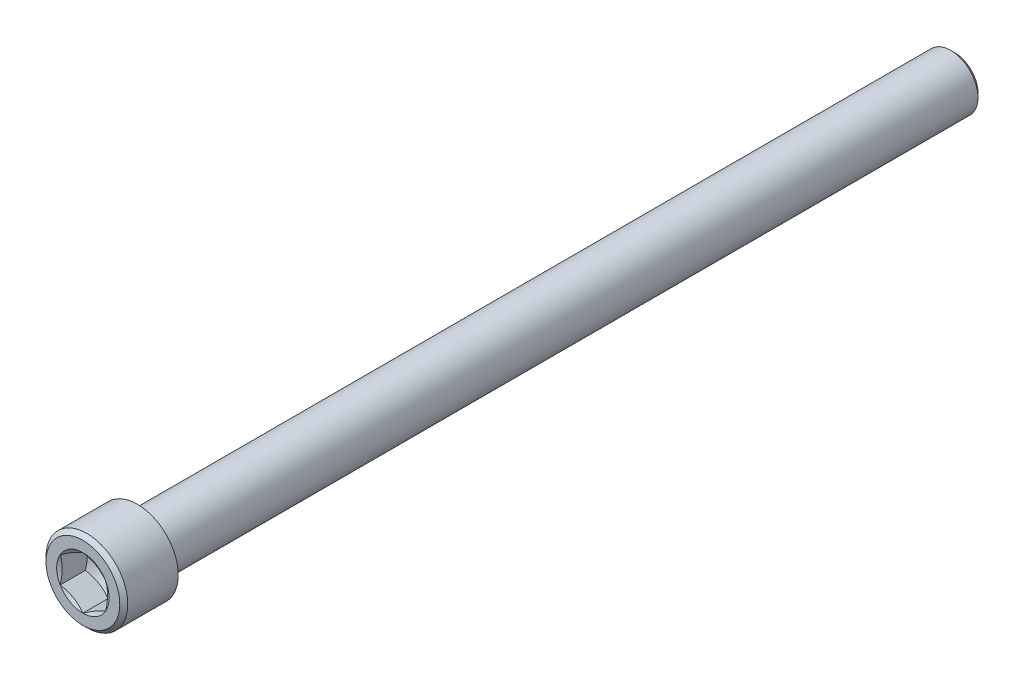
ISO-10303-21;
HEADER;
FILE_DESCRIPTION(('STEP AP214'),'2;1');
FILE_NAME('part.step','',(''),(''),'','','');
FILE_SCHEMA(('AUTOMOTIVE_DESIGN { 1 0 10303 214 1 1 1 1 }'));
ENDSEC;
DATA;
#1=APPLICATION_CONTEXT('core data for automotive mechanical design processes');
#2=APPLICATION_PROTOCOL_DEFINITION('international standard','automotive_design',2000,#1);
#3=PRODUCT_CONTEXT('',#1,'mechanical');
#4=PRODUCT('Part','Part','',(#3));
#5=PRODUCT_RELATED_PRODUCT_CATEGORY('part','',(#4));
#6=PRODUCT_DEFINITION_FORMATION('','',#4);
#7=PRODUCT_DEFINITION_CONTEXT('part definition',#1,'design');
#8=PRODUCT_DEFINITION('design','',#6,#7);
#9=PRODUCT_DEFINITION_SHAPE('','',#8);
#10=(LENGTH_UNIT() NAMED_UNIT(*) SI_UNIT(.MILLI.,.METRE.));
#11=(NAMED_UNIT(*) PLANE_ANGLE_UNIT() SI_UNIT($,.RADIAN.));
#12=(NAMED_UNIT(*) SI_UNIT($,.STERADIAN.) SOLID_ANGLE_UNIT());
#13=UNCERTAINTY_MEASURE_WITH_UNIT(LENGTH_MEASURE(1.E-05),#10,'distance_accuracy_value','');
#14=(GEOMETRIC_REPRESENTATION_CONTEXT(3) GLOBAL_UNCERTAINTY_ASSIGNED_CONTEXT((#13)) GLOBAL_UNIT_ASSIGNED_CONTEXT((#10,
#11,#12)) REPRESENTATION_CONTEXT('',''));
#15=CARTESIAN_POINT('',(0.,0.,0.));
#16=DIRECTION('',(0.,0.,1.));
#17=DIRECTION('',(1.,0.,0.));
#18=AXIS2_PLACEMENT_3D('',#15,#16,#17);
#19=CARTESIAN_POINT('',(0.,9.,12.));
#20=DIRECTION('',(0.,0.,-1.));
#21=DIRECTION('',(0.,1.,0.));
#22=AXIS2_PLACEMENT_3D('',#19,#20,#21);
#23=PLANE('',#22);
#24=CARTESIAN_POINT('',(0.,0.,12.));
#25=DIRECTION('',(0.,0.,-1.));
#26=DIRECTION('',(0.,1.,0.));
#27=AXIS2_PLACEMENT_3D('',#24,#25,#26);
#28=CIRCLE('',#27,8.125);
#29=CARTESIAN_POINT('',(0.,8.125,12.));
#30=VERTEX_POINT('',#29);
#31=EDGE_CURVE('E287',#30,#30,#28,.F.);
#32=ORIENTED_EDGE('',*,*,#31,.T.);
#33=EDGE_LOOP('',(#32));
#34=FACE_BOUND('',#33,.T.);
#35=CARTESIAN_POINT('',(0.,0.,12.));
#36=DIRECTION('',(0.,0.,-1.));
#37=DIRECTION('',(0.,1.,0.));
#38=AXIS2_PLACEMENT_3D('',#35,#36,#37);
#39=CIRCLE('',#38,5.77350269189626);
#40=CARTESIAN_POINT('',(0.,5.77350269189626,12.));
#41=VERTEX_POINT('',#40);
#42=CARTESIAN_POINT('',(-5.,2.88675134594813,12.));
#43=VERTEX_POINT('',#42);
#44=EDGE_CURVE('E111',#41,#43,#39,.F.);
#45=ORIENTED_EDGE('',*,*,#44,.F.);
#46=CARTESIAN_POINT('',(5.,2.88675134594813,12.));
#47=VERTEX_POINT('',#46);
#48=EDGE_CURVE('E100',#47,#41,#39,.F.);
#49=ORIENTED_EDGE('',*,*,#48,.F.);
#50=CARTESIAN_POINT('',(5.,-2.88675134594813,12.));
#51=VERTEX_POINT('',#50);
#52=EDGE_CURVE('E109',#51,#47,#39,.F.);
#53=ORIENTED_EDGE('',*,*,#52,.F.);
#54=CARTESIAN_POINT('',(0.,-5.77350269189626,12.));
#55=VERTEX_POINT('',#54);
#56=EDGE_CURVE('E424',#55,#51,#39,.F.);
#57=ORIENTED_EDGE('',*,*,#56,.F.);
#58=CARTESIAN_POINT('',(-5.,-2.88675134594813,12.));
#59=VERTEX_POINT('',#58);
#60=EDGE_CURVE('E139',#59,#55,#39,.F.);
#61=ORIENTED_EDGE('',*,*,#60,.F.);
#62=EDGE_CURVE('E138',#43,#59,#39,.F.);
#63=ORIENTED_EDGE('',*,*,#62,.F.);
#64=EDGE_LOOP('',(#45,#49,#53,#57,#61,#63));
#65=FACE_BOUND('',#64,.T.);
#66=ADVANCED_FACE('F44',(#34,#65),#23,.F.);
#67=CARTESIAN_POINT('',(0.,6.,0.));
#68=DIRECTION('',(0.,0.,1.));
#69=DIRECTION('',(0.,-1.,0.));
#70=AXIS2_PLACEMENT_3D('',#67,#68,#69);
#71=PLANE('',#70);
#72=CARTESIAN_POINT('',(0.,0.,0.));
#73=DIRECTION('',(0.,0.,1.));
#74=DIRECTION('',(0.,-1.,0.));
#75=AXIS2_PLACEMENT_3D('',#72,#73,#74);
#76=CIRCLE('',#75,6.6);
#77=CARTESIAN_POINT('',(0.,-6.6,0.));
#78=VERTEX_POINT('',#77);
#79=EDGE_CURVE('E52',#78,#78,#76,.T.);
#80=ORIENTED_EDGE('',*,*,#79,.T.);
#81=EDGE_LOOP('',(#80));
#82=FACE_BOUND('',#81,.T.);
#83=CARTESIAN_POINT('',(0.,0.,0.));
#84=DIRECTION('',(0.,0.,1.));
#85=DIRECTION('',(0.,-1.,0.));
#86=AXIS2_PLACEMENT_3D('',#83,#84,#85);
#87=CIRCLE('',#86,9.);
#88=CARTESIAN_POINT('',(0.,-9.,0.));
#89=VERTEX_POINT('',#88);
#90=EDGE_CURVE('E403',#89,#89,#87,.T.);
#91=ORIENTED_EDGE('',*,*,#90,.F.);
#92=EDGE_LOOP('',(#91));
#93=FACE_BOUND('',#92,.T.);
#94=ADVANCED_FACE('F249',(#82,#93),#71,.F.);
#95=CARTESIAN_POINT('',(0.,0.,12.));
#96=DIRECTION('',(0.,0.,1.));
#97=DIRECTION('',(0.,-1.,0.));
#98=AXIS2_PLACEMENT_3D('',#95,#96,#97);
#99=CYLINDRICAL_SURFACE('',#98,6.);
#100=CARTESIAN_POINT('',(0.,0.,-0.6));
#101=DIRECTION('',(0.,0.,1.));
#102=DIRECTION('',(0.,-1.,0.));
#103=AXIS2_PLACEMENT_3D('',#100,#101,#102);
#104=CIRCLE('',#103,6.);
#105=CARTESIAN_POINT('',(0.,-6.,-0.6));
#106=VERTEX_POINT('',#105);
#107=EDGE_CURVE('E12',#106,#106,#104,.F.);
#108=ORIENTED_EDGE('',*,*,#107,.T.);
#109=EDGE_LOOP('',(#108));
#110=FACE_BOUND('',#109,.T.);
#111=CARTESIAN_POINT('',(0.,0.,-179.125));
#112=DIRECTION('',(0.,0.,1.));
#113=DIRECTION('',(0.,-1.,0.));
#114=AXIS2_PLACEMENT_3D('',#111,#112,#113);
#115=CIRCLE('',#114,6.);
#116=CARTESIAN_POINT('',(0.,-6.,-179.125));
#117=VERTEX_POINT('',#116);
#118=EDGE_CURVE('E281',#117,#117,#115,.T.);
#119=ORIENTED_EDGE('',*,*,#118,.T.);
#120=EDGE_LOOP('',(#119));
#121=FACE_BOUND('',#120,.T.);
#122=ADVANCED_FACE('F255',(#110,#121),#99,.T.);
#123=CARTESIAN_POINT('',(0.,0.,-180.));
#124=DIRECTION('',(0.,0.,1.));
#125=DIRECTION('',(0.,-1.,0.));
#126=AXIS2_PLACEMENT_3D('',#123,#124,#125);
#127=PLANE('',#126);
#128=CARTESIAN_POINT('',(0.,0.,-180.));
#129=DIRECTION('',(0.,0.,1.));
#130=DIRECTION('',(0.,-1.,0.));
#131=AXIS2_PLACEMENT_3D('',#128,#129,#130);
#132=CIRCLE('',#131,5.12499999999998);
#133=CARTESIAN_POINT('',(0.,-5.12499999999998,-180.));
#134=VERTEX_POINT('',#133);
#135=EDGE_CURVE('E121',#134,#134,#132,.F.);
#136=ORIENTED_EDGE('',*,*,#135,.T.);
#137=EDGE_LOOP('',(#136));
#138=FACE_BOUND('',#137,.T.);
#139=ADVANCED_FACE('F260',(#138),#127,.F.);
#140=CARTESIAN_POINT('',(0.,0.,12.));
#141=DIRECTION('',(0.,0.,1.));
#142=DIRECTION('',(0.,-1.,0.));
#143=AXIS2_PLACEMENT_3D('',#140,#141,#142);
#144=CYLINDRICAL_SURFACE('',#143,9.);
#145=CARTESIAN_POINT('',(0.,0.,11.125));
#146=DIRECTION('',(0.,0.,-1.));
#147=DIRECTION('',(0.,1.,0.));
#148=AXIS2_PLACEMENT_3D('',#145,#146,#147);
#149=CIRCLE('',#148,9.);
#150=CARTESIAN_POINT('',(0.,9.,11.125));
#151=VERTEX_POINT('',#150);
#152=EDGE_CURVE('E283',#151,#151,#149,.T.);
#153=ORIENTED_EDGE('',*,*,#152,.T.);
#154=EDGE_LOOP('',(#153));
#155=FACE_BOUND('',#154,.T.);
#156=ORIENTED_EDGE('',*,*,#90,.T.);
#157=EDGE_LOOP('',(#156));
#158=FACE_BOUND('',#157,.T.);
#159=ADVANCED_FACE('F173',(#155,#158),#144,.T.);
#160=CARTESIAN_POINT('',(0.,0.,12.));
#161=DIRECTION('',(0.,0.,-1.));
#162=DIRECTION('',(0.,1.,0.));
#163=AXIS2_PLACEMENT_3D('',#160,#161,#162);
#164=CONICAL_SURFACE('',#163,8.125,0.785398163397442);
#165=ORIENTED_EDGE('',*,*,#152,.F.);
#166=EDGE_LOOP('',(#165));
#167=FACE_BOUND('',#166,.T.);
#168=ORIENTED_EDGE('',*,*,#31,.F.);
#169=EDGE_LOOP('',(#168));
#170=FACE_BOUND('',#169,.T.);
#171=ADVANCED_FACE('F267',(#167,#170),#164,.T.);
#172=CARTESIAN_POINT('',(0.,0.,-179.125));
#173=DIRECTION('',(0.,0.,1.));
#174=DIRECTION('',(0.,-1.,0.));
#175=AXIS2_PLACEMENT_3D('',#172,#173,#174);
#176=CONICAL_SURFACE('',#175,6.,0.785398163397454);
#177=ORIENTED_EDGE('',*,*,#135,.F.);
#178=EDGE_LOOP('',(#177));
#179=FACE_BOUND('',#178,.T.);
#180=ORIENTED_EDGE('',*,*,#118,.F.);
#181=EDGE_LOOP('',(#180));
#182=FACE_BOUND('',#181,.T.);
#183=ADVANCED_FACE('F269',(#179,#182),#176,.T.);
#184=CARTESIAN_POINT('',(0.,0.,11.5534180126148));
#185=DIRECTION('',(0.,0.,1.));
#186=DIRECTION('',(0.,-1.,0.));
#187=AXIS2_PLACEMENT_3D('',#184,#185,#186);
#188=CONICAL_SURFACE('',#187,5.,1.04719755119659);
#189=ORIENTED_EDGE('',*,*,#44,.T.);
#190=CARTESIAN_POINT('',(-5.0002,2.88663587589429,12.0000666686666));
#191=CARTESIAN_POINT('',(-4.78046540547481,3.01349970319368,11.9268045802524));
#192=CARTESIAN_POINT('',(-4.55885141554042,3.14144859993849,11.8601693345329));
#193=CARTESIAN_POINT('',(-4.11178600454648,3.39956193532121,11.7438570036256));
#194=CARTESIAN_POINT('',(-3.88632664040922,3.52973095989718,11.6942210625306));
#195=CARTESIAN_POINT('',(-3.43816769477649,3.78847564779798,11.6169690380335));
#196=CARTESIAN_POINT('',(-3.2155379068958,3.91701101576052,11.5888383908983));
#197=CARTESIAN_POINT('',(-2.88081009815335,4.11026620624323,11.5636129345685));
#198=CARTESIAN_POINT('',(-2.76915780319493,4.17472868879311,11.5580314723843));
#199=CARTESIAN_POINT('',(-2.5457500293262,4.30371322717528,11.5526202293663));
#200=CARTESIAN_POINT('',(-2.43399455370968,4.36823528110589,11.552790270873));
#201=CARTESIAN_POINT('',(-2.12781576914936,4.54500768479195,11.5611716444068));
#202=CARTESIAN_POINT('',(-1.93349391403278,4.65719946015293,11.575247784512));
#203=CARTESIAN_POINT('',(-1.54613989800229,4.88083840557981,11.6198832697242));
#204=CARTESIAN_POINT('',(-1.35310909862843,4.9922847895602,11.6504578727623));
#205=CARTESIAN_POINT('',(-0.964974657525143,5.21637431361295,11.726886506236));
#206=CARTESIAN_POINT('',(-0.769920001358262,5.32898917185759,11.7730643914935));
#207=CARTESIAN_POINT('',(-0.382719654641231,5.55253939626498,11.8778698071067));
#208=CARTESIAN_POINT('',(-0.190569004591913,5.66347762579592,11.9364727160522));
#209=CARTESIAN_POINT('',(0.000200000000000217,5.7736181619501,12.0000666686666));
#210=B_SPLINE_CURVE_WITH_KNOTS('',3,(#190,#191,#192,#193,#194,#195,#196,#197,#198,#199,#200,
#201,#202,#203,#204,#205,#206,#207,#208,#209),.UNSPECIFIED.,.F.,.F.,(4,2,2,2,2,2,2,2,2,4),(0.,
0.792555841363093,1.58701660053334,2.36181537487281,2.74884076077326,3.13585419177296,
3.8096236259968,4.4840172390119,5.17336882348929,5.86136694793725),.UNSPECIFIED.);
#211=EDGE_CURVE('E115',#43,#41,#210,.T.);
#212=ORIENTED_EDGE('',*,*,#211,.T.);
#213=EDGE_LOOP('',(#189,#212));
#214=FACE_BOUND('',#213,.T.);
#215=ADVANCED_FACE('F116',(#214),#188,.F.);
#216=ORIENTED_EDGE('',*,*,#62,.T.);
#217=CARTESIAN_POINT('',(-5.,-7.65608998744865,13.9460515391656));
#218=CARTESIAN_POINT('',(-5.,-7.43656171400166,13.8399633507869));
#219=CARTESIAN_POINT('',(-5.,-7.21651440170021,13.7349297672308));
#220=CARTESIAN_POINT('',(-5.,-6.77510105921518,13.5275744462546));
#221=CARTESIAN_POINT('',(-5.,-6.55373480873052,13.4252531783605));
#222=CARTESIAN_POINT('',(-5.,-6.10820714710357,13.2233860911497));
#223=CARTESIAN_POINT('',(-5.,-5.88403698971124,13.1238595054321));
#224=CARTESIAN_POINT('',(-5.,-5.43385418074677,12.9290812454016));
#225=CARTESIAN_POINT('',(-5.,-5.20784162594278,12.8338293482572));
#226=CARTESIAN_POINT('',(-5.,-4.75080884782756,12.6476063218042));
#227=CARTESIAN_POINT('',(-5.,-4.51976121099505,12.5567021036135));
#228=CARTESIAN_POINT('',(-5.,-4.05494053422099,12.3820133155867));
#229=CARTESIAN_POINT('',(-5.,-3.82116719434024,12.2982295378625));
#230=CARTESIAN_POINT('',(-5.,-3.35100416711889,12.1400326449794));
#231=CARTESIAN_POINT('',(-5.,-3.11462125088187,12.0655996078401));
#232=CARTESIAN_POINT('',(-5.,-2.63849247870023,11.9285224064872));
#233=CARTESIAN_POINT('',(-5.,-2.3987477121033,11.8658745142117));
#234=CARTESIAN_POINT('',(-5.,-1.91574303714497,11.7554057666097));
#235=CARTESIAN_POINT('',(-5.,-1.67248221084099,11.7075888591734));
#236=CARTESIAN_POINT('',(-5.,-1.18299359688663,11.6300135684072));
#237=CARTESIAN_POINT('',(-5.,-0.936765806613275,11.6002552010432));
#238=CARTESIAN_POINT('',(-5.,-0.567032279323841,11.5710692142011));
#239=CARTESIAN_POINT('',(-5.,-0.444105297658533,11.5639143316747));
#240=CARTESIAN_POINT('',(-5.,-0.198053005238558,11.5548134648838));
#241=CARTESIAN_POINT('',(-5.,-0.0749276970802213,11.5528674129752));
#242=CARTESIAN_POINT('',(-5.,0.171257999892361,11.5542364829605));
#243=CARTESIAN_POINT('',(-5.,0.294318397227096,11.5575501269278));
#244=CARTESIAN_POINT('',(-5.,0.540192730788848,11.5693546098976));
#245=CARTESIAN_POINT('',(-5.,0.663006654263491,11.577845710185));
#246=CARTESIAN_POINT('',(-5.,0.960681872881673,11.6045243928901));
#247=CARTESIAN_POINT('',(-5.,1.1353143627994,11.6253069803131));
#248=CARTESIAN_POINT('',(-5.,1.48321675799389,11.6761836683375));
#249=CARTESIAN_POINT('',(-5.,1.65648647841236,11.7062790106048));
#250=CARTESIAN_POINT('',(-5.,2.00155426058699,11.7747168046263));
#251=CARTESIAN_POINT('',(-5.,2.17335067370373,11.8130674901012));
#252=CARTESIAN_POINT('',(-5.,2.51518168221053,11.8968463179998));
#253=CARTESIAN_POINT('',(-5.,2.6852163841931,11.9422740295288));
#254=CARTESIAN_POINT('',(-5.,3.02770318928891,12.0403057946691));
#255=CARTESIAN_POINT('',(-5.,3.20011248435311,12.0930583764387));
#256=CARTESIAN_POINT('',(-5.,3.54310870430175,12.2037757999174));
#257=CARTESIAN_POINT('',(-5.,3.71369679659713,12.2617370465219));
#258=CARTESIAN_POINT('',(-5.,4.05236610267972,12.3816745533433));
#259=CARTESIAN_POINT('',(-5.,4.22045602230054,12.4436263780412));
#260=CARTESIAN_POINT('',(-5.,4.55533171687446,12.5711662467529));
#261=CARTESIAN_POINT('',(-5.,4.72211693321413,12.6367557604026));
#262=CARTESIAN_POINT('',(-5.,4.88829623733353,12.703804270792));
#263=B_SPLINE_CURVE_WITH_KNOTS('',3,(#217,#218,#219,#220,#221,#222,#223,#224,#225,#226,#227,
#228,#229,#230,#231,#232,#233,#234,#235,#236,#237,#238,#239,#240,#241,#242,#243,#244,#245,#246,
#247,#248,#249,#250,#251,#252,#253,#254,#255,#256,#257,#258,#259,#260,#261,#262),.UNSPECIFIED.,
.F.,.F.,(4,2,2,2,2,2,2,2,2,2,2,2,2,2,2,2,2,2,2,2,2,2,4),(0.,0.731464740665352,1.46305528824909,
2.19883243307486,2.93457117856034,3.67934251246858,4.42419659013361,5.1674358087199,
5.91043951739339,6.65364083834807,7.39684281638516,7.76615414335457,8.13546067426611,
8.50466345177857,8.87388486298453,9.40118542949727,9.92855633110015,10.4564556797854,
10.9843228991235,11.525120280828,12.065547221064,12.6029322754131,13.1405360390026),.UNSPECIFIED.);
#264=EDGE_CURVE('E231',#59,#43,#263,.T.);
#265=ORIENTED_EDGE('',*,*,#264,.T.);
#266=EDGE_LOOP('',(#216,#265));
#267=FACE_BOUND('',#266,.T.);
#268=ADVANCED_FACE('F275',(#267),#188,.F.);
#269=ORIENTED_EDGE('',*,*,#60,.T.);
#270=CARTESIAN_POINT('',(0.000200000000000874,-5.77361816195009,12.0000666686666));
#271=CARTESIAN_POINT('',(-0.219534594525184,-5.6467543346507,11.9268045802524));
#272=CARTESIAN_POINT('',(-0.44114858445958,-5.51880543790589,11.8601693345329));
#273=CARTESIAN_POINT('',(-0.888213995453514,-5.26069210252318,11.7438570036256));
#274=CARTESIAN_POINT('',(-1.11367335959078,-5.13052307794721,11.6942210625306));
#275=CARTESIAN_POINT('',(-1.56183230522351,-4.87177839004641,11.6169690380335));
#276=CARTESIAN_POINT('',(-1.78446209310419,-4.74324302208387,11.5888383908983));
#277=CARTESIAN_POINT('',(-2.11918990184665,-4.54998783160116,11.5636129345685));
#278=CARTESIAN_POINT('',(-2.23084219680507,-4.48552534905128,11.5580314723843));
#279=CARTESIAN_POINT('',(-2.4542499706738,-4.35654081066911,11.5526202293663));
#280=CARTESIAN_POINT('',(-2.56600544629032,-4.2920187567385,11.552790270873));
#281=CARTESIAN_POINT('',(-2.87218423085064,-4.11524635305244,11.5611716444068));
#282=CARTESIAN_POINT('',(-3.06650608596722,-4.00305457769146,11.575247784512));
#283=CARTESIAN_POINT('',(-3.45386010199771,-3.77941563226457,11.6198832697242));
#284=CARTESIAN_POINT('',(-3.64689090137157,-3.66796924828418,11.6504578727623));
#285=CARTESIAN_POINT('',(-4.03502534247485,-3.44387972423144,11.726886506236));
#286=CARTESIAN_POINT('',(-4.23007999864174,-3.3312648659868,11.7730643914935));
#287=CARTESIAN_POINT('',(-4.61728034535877,-3.1077146415794,11.8778698071067));
#288=CARTESIAN_POINT('',(-4.80943099540808,-2.99677641204847,11.9364727160522));
#289=CARTESIAN_POINT('',(-5.0002,-2.88663587589429,12.0000666686666));
#290=B_SPLINE_CURVE_WITH_KNOTS('',3,(#270,#271,#272,#273,#274,#275,#276,#277,#278,#279,#280,
#281,#282,#283,#284,#285,#286,#287,#288,#289),.UNSPECIFIED.,.F.,.F.,(4,2,2,2,2,2,2,2,2,4),(0.,
0.792555841363093,1.58701660053334,2.36181537487281,2.74884076077326,3.13585419177296,
3.8096236259968,4.4840172390119,5.17336882348929,5.86136694793725),.UNSPECIFIED.);
#291=EDGE_CURVE('E225',#55,#59,#290,.T.);
#292=ORIENTED_EDGE('',*,*,#291,.T.);
#293=EDGE_LOOP('',(#269,#292));
#294=FACE_BOUND('',#293,.T.);
#295=ADVANCED_FACE('F336',(#294),#188,.F.);
#296=ORIENTED_EDGE('',*,*,#56,.T.);
#297=CARTESIAN_POINT('',(5.0002,-2.88663587589429,12.0000666686666));
#298=CARTESIAN_POINT('',(4.78046540547481,-3.01349970319368,11.9268045802524));
#299=CARTESIAN_POINT('',(4.55885141554042,-3.14144859993849,11.8601693345329));
#300=CARTESIAN_POINT('',(4.11178600454648,-3.39956193532121,11.7438570036256));
#301=CARTESIAN_POINT('',(3.88632664040922,-3.52973095989718,11.6942210625306));
#302=CARTESIAN_POINT('',(3.43816769477649,-3.78847564779798,11.6169690380335));
#303=CARTESIAN_POINT('',(3.2155379068958,-3.91701101576052,11.5888383908983));
#304=CARTESIAN_POINT('',(2.88081009815336,-4.11026620624323,11.5636129345685));
#305=CARTESIAN_POINT('',(2.76915780319494,-4.17472868879311,11.5580314723843));
#306=CARTESIAN_POINT('',(2.5457500293262,-4.30371322717528,11.5526202293663));
#307=CARTESIAN_POINT('',(2.43399455370968,-4.36823528110589,11.552790270873));
#308=CARTESIAN_POINT('',(2.12781576914936,-4.54500768479194,11.5611716444068));
#309=CARTESIAN_POINT('',(1.93349391403278,-4.65719946015293,11.575247784512));
#310=CARTESIAN_POINT('',(1.54613989800229,-4.88083840557981,11.6198832697242));
#311=CARTESIAN_POINT('',(1.35310909862843,-4.9922847895602,11.6504578727623));
#312=CARTESIAN_POINT('',(0.964974657525143,-5.21637431361295,11.726886506236));
#313=CARTESIAN_POINT('',(0.769920001358262,-5.32898917185759,11.7730643914935));
#314=CARTESIAN_POINT('',(0.382719654641231,-5.55253939626498,11.8778698071067));
#315=CARTESIAN_POINT('',(0.190569004591914,-5.66347762579592,11.9364727160522));
#316=CARTESIAN_POINT('',(-0.000199999999999276,-5.77361816195009,12.0000666686666));
#317=B_SPLINE_CURVE_WITH_KNOTS('',3,(#297,#298,#299,#300,#301,#302,#303,#304,#305,#306,#307,
#308,#309,#310,#311,#312,#313,#314,#315,#316),.UNSPECIFIED.,.F.,.F.,(4,2,2,2,2,2,2,2,2,4),(0.,
0.792555841363093,1.58701660053334,2.36181537487281,2.74884076077326,3.13585419177296,
3.8096236259968,4.4840172390119,5.17336882348929,5.86136694793725),.UNSPECIFIED.);
#318=EDGE_CURVE('E64',#51,#55,#317,.T.);
#319=ORIENTED_EDGE('',*,*,#318,.T.);
#320=EDGE_LOOP('',(#296,#319));
#321=FACE_BOUND('',#320,.T.);
#322=ADVANCED_FACE('F343',(#321),#188,.F.);
#323=ORIENTED_EDGE('',*,*,#52,.T.);
#324=CARTESIAN_POINT('',(5.,-7.65608998744865,13.9460515391656));
#325=CARTESIAN_POINT('',(5.,-7.43656171400166,13.8399633507869));
#326=CARTESIAN_POINT('',(5.,-7.21651440170021,13.7349297672308));
#327=CARTESIAN_POINT('',(5.,-6.77510105921518,13.5275744462546));
#328=CARTESIAN_POINT('',(5.,-6.55373480873052,13.4252531783605));
#329=CARTESIAN_POINT('',(5.,-6.10820714710356,13.2233860911497));
#330=CARTESIAN_POINT('',(5.,-5.88403698971124,13.1238595054321));
#331=CARTESIAN_POINT('',(5.,-5.43385418074676,12.9290812454016));
#332=CARTESIAN_POINT('',(5.,-5.20784162594277,12.8338293482572));
#333=CARTESIAN_POINT('',(5.,-4.75080884782755,12.6476063218042));
#334=CARTESIAN_POINT('',(5.,-4.51976121099505,12.5567021036135));
#335=CARTESIAN_POINT('',(5.,-4.05494053422099,12.3820133155867));
#336=CARTESIAN_POINT('',(5.,-3.82116719434024,12.2982295378624));
#337=CARTESIAN_POINT('',(5.,-3.35100416711888,12.1400326449794));
#338=CARTESIAN_POINT('',(5.,-3.11462125088187,12.0655996078401));
#339=CARTESIAN_POINT('',(5.,-2.63849247870023,11.9285224064872));
#340=CARTESIAN_POINT('',(5.,-2.3987477121033,11.8658745142117));
#341=CARTESIAN_POINT('',(5.,-1.91574303714496,11.7554057666097));
#342=CARTESIAN_POINT('',(5.,-1.67248221084099,11.7075888591734));
#343=CARTESIAN_POINT('',(5.,-1.18299359688663,11.6300135684072));
#344=CARTESIAN_POINT('',(5.,-0.936765806613274,11.6002552010432));
#345=CARTESIAN_POINT('',(5.,-0.56703227932384,11.5710692142011));
#346=CARTESIAN_POINT('',(5.,-0.444105297658532,11.5639143316747));
#347=CARTESIAN_POINT('',(5.,-0.198053005238557,11.5548134648838));
#348=CARTESIAN_POINT('',(5.,-0.0749276970802206,11.5528674129752));
#349=CARTESIAN_POINT('',(5.,0.171257999892361,11.5542364829605));
#350=CARTESIAN_POINT('',(5.,0.294318397227096,11.5575501269278));
#351=CARTESIAN_POINT('',(5.,0.540192730788848,11.5693546098976));
#352=CARTESIAN_POINT('',(5.,0.663006654263492,11.577845710185));
#353=CARTESIAN_POINT('',(5.,0.960681872881675,11.6045243928901));
#354=CARTESIAN_POINT('',(5.,1.1353143627994,11.6253069803131));
#355=CARTESIAN_POINT('',(5.,1.48321675799389,11.6761836683375));
#356=CARTESIAN_POINT('',(5.,1.65648647841237,11.7062790106048));
#357=CARTESIAN_POINT('',(5.,2.00155426058699,11.7747168046263));
#358=CARTESIAN_POINT('',(5.,2.17335067370373,11.8130674901012));
#359=CARTESIAN_POINT('',(5.,2.51518168221054,11.8968463179998));
#360=CARTESIAN_POINT('',(5.,2.6852163841931,11.9422740295288));
#361=CARTESIAN_POINT('',(5.,3.02770318928891,12.0403057946691));
#362=CARTESIAN_POINT('',(5.,3.20011248435311,12.0930583764387));
#363=CARTESIAN_POINT('',(5.,3.54310870430176,12.2037757999174));
#364=CARTESIAN_POINT('',(5.,3.71369679659713,12.2617370465219));
#365=CARTESIAN_POINT('',(5.,4.05236610267972,12.3816745533433));
#366=CARTESIAN_POINT('',(5.,4.22045602230054,12.4436263780412));
#367=CARTESIAN_POINT('',(5.,4.55533171687446,12.5711662467529));
#368=CARTESIAN_POINT('',(5.,4.72211693321413,12.6367557604026));
#369=CARTESIAN_POINT('',(5.,4.88829623733353,12.703804270792));
#370=B_SPLINE_CURVE_WITH_KNOTS('',3,(#324,#325,#326,#327,#328,#329,#330,#331,#332,#333,#334,
#335,#336,#337,#338,#339,#340,#341,#342,#343,#344,#345,#346,#347,#348,#349,#350,#351,#352,#353,
#354,#355,#356,#357,#358,#359,#360,#361,#362,#363,#364,#365,#366,#367,#368,#369),.UNSPECIFIED.,
.F.,.F.,(4,2,2,2,2,2,2,2,2,2,2,2,2,2,2,2,2,2,2,2,2,2,4),(0.,0.731464740665352,1.46305528824909,
2.19883243307486,2.93457117856034,3.67934251246858,4.42419659013362,5.1674358087199,
5.91043951739339,6.65364083834807,7.39684281638517,7.76615414335457,8.13546067426611,
8.50466345177857,8.87388486298454,9.40118542949728,9.92855633110015,10.4564556797854,
10.9843228991235,11.525120280828,12.065547221064,12.6029322754131,13.1405360390026),.UNSPECIFIED.);
#371=EDGE_CURVE('E58',#47,#51,#370,.F.);
#372=ORIENTED_EDGE('',*,*,#371,.T.);
#373=EDGE_LOOP('',(#323,#372));
#374=FACE_BOUND('',#373,.T.);
#375=ADVANCED_FACE('F350',(#374),#188,.F.);
#376=ORIENTED_EDGE('',*,*,#48,.T.);
#377=CARTESIAN_POINT('',(-0.000200000000000016,5.77361816195009,12.0000666686666));
#378=CARTESIAN_POINT('',(0.219534594525185,5.64675433465071,11.9268045802524));
#379=CARTESIAN_POINT('',(0.441148584459581,5.5188054379059,11.8601693345329));
#380=CARTESIAN_POINT('',(0.888213995453515,5.26069210252318,11.7438570036256));
#381=CARTESIAN_POINT('',(1.11367335959078,5.13052307794721,11.6942210625306));
#382=CARTESIAN_POINT('',(1.56183230522351,4.87177839004641,11.6169690380335));
#383=CARTESIAN_POINT('',(1.7844620931042,4.74324302208387,11.5888383908983));
#384=CARTESIAN_POINT('',(2.11918990184665,4.54998783160116,11.5636129345685));
#385=CARTESIAN_POINT('',(2.23084219680507,4.48552534905128,11.5580314723843));
#386=CARTESIAN_POINT('',(2.4542499706738,4.35654081066911,11.5526202293663));
#387=CARTESIAN_POINT('',(2.56600544629032,4.2920187567385,11.552790270873));
#388=CARTESIAN_POINT('',(2.87218423085064,4.11524635305244,11.5611716444068));
#389=CARTESIAN_POINT('',(3.06650608596722,4.00305457769146,11.575247784512));
#390=CARTESIAN_POINT('',(3.45386010199771,3.77941563226457,11.6198832697242));
#391=CARTESIAN_POINT('',(3.64689090137157,3.66796924828418,11.6504578727623));
#392=CARTESIAN_POINT('',(4.03502534247485,3.44387972423144,11.726886506236));
#393=CARTESIAN_POINT('',(4.23007999864174,3.3312648659868,11.7730643914935));
#394=CARTESIAN_POINT('',(4.61728034535877,3.10771464157941,11.8778698071067));
#395=CARTESIAN_POINT('',(4.80943099540808,2.99677641204847,11.9364727160522));
#396=CARTESIAN_POINT('',(5.0002,2.88663587589429,12.0000666686666));
#397=B_SPLINE_CURVE_WITH_KNOTS('',3,(#377,#378,#379,#380,#381,#382,#383,#384,#385,#386,#387,
#388,#389,#390,#391,#392,#393,#394,#395,#396),.UNSPECIFIED.,.F.,.F.,(4,2,2,2,2,2,2,2,2,4),(0.,
0.792555841363092,1.58701660053334,2.36181537487281,2.74884076077326,3.13585419177296,
3.8096236259968,4.48401723901189,5.17336882348929,5.86136694793725),.UNSPECIFIED.);
#398=EDGE_CURVE('E104',#41,#47,#397,.T.);
#399=ORIENTED_EDGE('',*,*,#398,.T.);
#400=EDGE_LOOP('',(#376,#399));
#401=FACE_BOUND('',#400,.T.);
#402=ADVANCED_FACE('F102',(#401),#188,.F.);
#403=CARTESIAN_POINT('',(0.,0.,3.11324865405189));
#404=DIRECTION('',(0.,0.,1.));
#405=DIRECTION('',(1.,0.,0.));
#406=AXIS2_PLACEMENT_3D('',#403,#404,#405);
#407=CONICAL_SURFACE('',#406,0.,1.0471975511966);
#408=CARTESIAN_POINT('',(5.0002,-2.88663587589429,6.44664865605183));
#409=CARTESIAN_POINT('',(4.78046540547481,-3.01349970319368,6.37338656763764));
#410=CARTESIAN_POINT('',(4.55885141554042,-3.14144859993849,6.30675132191809));
#411=CARTESIAN_POINT('',(4.11178600454648,-3.39956193532121,6.19043899101081));
#412=CARTESIAN_POINT('',(3.88632664040922,-3.52973095989718,6.14080304991579));
#413=CARTESIAN_POINT('',(3.43816769477649,-3.78847564779798,6.0635510254187));
#414=CARTESIAN_POINT('',(3.21553790689581,-3.91701101576052,6.03542037828349));
#415=CARTESIAN_POINT('',(2.88081009815336,-4.11026620624322,6.01019492195369));
#416=CARTESIAN_POINT('',(2.76915780319494,-4.17472868879311,6.00461345976949));
#417=CARTESIAN_POINT('',(2.5457500293262,-4.30371322717528,5.99920221675147));
#418=CARTESIAN_POINT('',(2.43399455370968,-4.36823528110589,5.99937225825821));
#419=CARTESIAN_POINT('',(2.12781576914936,-4.54500768479194,6.00775363179204));
#420=CARTESIAN_POINT('',(1.93349391403278,-4.65719946015292,6.02182977189725));
#421=CARTESIAN_POINT('',(1.54613989800229,-4.88083840557981,6.06646525710943));
#422=CARTESIAN_POINT('',(1.35310909862843,-4.9922847895602,6.09703986014751));
#423=CARTESIAN_POINT('',(0.964974657525145,-5.21637431361295,6.17346849362117));
#424=CARTESIAN_POINT('',(0.769920001358264,-5.32898917185759,6.21964637887868));
#425=CARTESIAN_POINT('',(0.382719654641232,-5.55253939626498,6.32445179449194));
#426=CARTESIAN_POINT('',(0.190569004591914,-5.66347762579592,6.38305470343738));
#427=CARTESIAN_POINT('',(-0.000199999999999545,-5.77361816195009,6.44664865605183));
#428=B_SPLINE_CURVE_WITH_KNOTS('',3,(#408,#409,#410,#411,#412,#413,#414,#415,#416,#417,#418,
#419,#420,#421,#422,#423,#424,#425,#426,#427),.UNSPECIFIED.,.F.,.F.,(4,2,2,2,2,2,2,2,2,4),(0.,
0.792555841363091,1.58701660053333,2.36181537487281,2.74884076077325,3.13585419177295,
3.80962362599679,4.48401723901189,5.17336882348928,5.86136694793725),.UNSPECIFIED.);
#429=CARTESIAN_POINT('',(5.,-2.88675134594813,6.4465819873852));
#430=VERTEX_POINT('',#429);
#431=CARTESIAN_POINT('',(0.,-5.77350269189626,6.4465819873852));
#432=VERTEX_POINT('',#431);
#433=EDGE_CURVE('E187',#430,#432,#428,.T.);
#434=ORIENTED_EDGE('',*,*,#433,.F.);
#435=CARTESIAN_POINT('',(5.,-7.71798195908827,8.4225877692592));
#436=CARTESIAN_POINT('',(5.,-7.49970384938774,8.31684955613426));
#437=CARTESIAN_POINT('',(5.,-7.28092032870476,8.21213656307535));
#438=CARTESIAN_POINT('',(5.,-6.84207314635018,8.00533908557017));
#439=CARTESIAN_POINT('',(5.,-6.62200928533468,7.90325502463477));
#440=CARTESIAN_POINT('',(5.,-6.17918315376836,7.70177322448574));
#441=CARTESIAN_POINT('',(5.,-5.95641269360618,7.60239342182408));
#442=CARTESIAN_POINT('',(5.,-5.50908481382186,7.40775599483657));
#443=CARTESIAN_POINT('',(5.,-5.28452748085774,7.31249817203211));
#444=CARTESIAN_POINT('',(5.,-4.82657046421065,7.12444529954391));
#445=CARTESIAN_POINT('',(5.,-4.59310603722613,7.03180704880942));
#446=CARTESIAN_POINT('',(5.,-4.12343378353533,6.85362983870601));
#447=CARTESIAN_POINT('',(5.,-3.88722565122731,6.76809167897881));
#448=CARTESIAN_POINT('',(5.,-3.41214208875745,6.60638364727848));
#449=CARTESIAN_POINT('',(5.,-3.17327325072964,6.53019460448891));
#450=CARTESIAN_POINT('',(5.,-2.69211227036572,6.38965132467951));
#451=CARTESIAN_POINT('',(5.,-2.44982124095973,6.32529333135543));
#452=CARTESIAN_POINT('',(5.,-1.96281641516125,6.21181328196227));
#453=CARTESIAN_POINT('',(5.,-1.71811906730466,6.16262194662062));
#454=CARTESIAN_POINT('',(5.,-1.22572466862996,6.08235290687549));
#455=CARTESIAN_POINT('',(5.,-0.978027953890786,6.05127319189014));
#456=CARTESIAN_POINT('',(5.,-0.484068230438678,6.01011095987818));
#457=CARTESIAN_POINT('',(5.,-0.237827906493212,5.99976291252161));
#458=CARTESIAN_POINT('',(5.,0.254662804202139,6.00024526906332));
#459=CARTESIAN_POINT('',(5.,0.500913190421069,6.01107718018073));
#460=CARTESIAN_POINT('',(5.,0.919771265930184,6.0467554283319));
#461=CARTESIAN_POINT('',(5.,1.09283273745398,6.06657048064079));
#462=CARTESIAN_POINT('',(5.,1.43765967507733,6.11541146642548));
#463=CARTESIAN_POINT('',(5.,1.6094249610368,6.14443865689144));
#464=CARTESIAN_POINT('',(5.,2.12253233768447,6.24380732107773));
#465=CARTESIAN_POINT('',(5.,2.46152279862364,6.32642017633757));
#466=CARTESIAN_POINT('',(5.,2.96891814645914,6.46943410152972));
#467=CARTESIAN_POINT('',(5.,3.13995004131111,6.52104080559582));
#468=CARTESIAN_POINT('',(5.,3.48034882174402,6.62952941360672));
#469=CARTESIAN_POINT('',(5.,3.6497156930988,6.68641136258061));
#470=CARTESIAN_POINT('',(5.,3.98685300284084,6.80454695898974));
#471=CARTESIAN_POINT('',(5.,4.15462385512187,6.86579943594442));
#472=CARTESIAN_POINT('',(5.,4.4887736424069,6.99195640284236));
#473=CARTESIAN_POINT('',(5.,4.65515264399207,7.05686071693395));
#474=CARTESIAN_POINT('',(5.,5.03780012825315,7.21019970238217));
#475=CARTESIAN_POINT('',(5.,5.25363308256088,7.29971897518728));
#476=CARTESIAN_POINT('',(5.,5.68353815235805,7.48290118195396));
#477=CARTESIAN_POINT('',(5.,5.8976101743302,7.57656433431986));
#478=CARTESIAN_POINT('',(5.,6.3243108340175,7.76723069183952));
#479=CARTESIAN_POINT('',(5.,6.53693916495857,7.86423458182943));
#480=CARTESIAN_POINT('',(5.,6.96094691622292,8.06093838607697));
#481=CARTESIAN_POINT('',(5.,7.17232631187785,8.16063835337073));
#482=CARTESIAN_POINT('',(5.,7.8051822136081,8.46315747608118));
#483=CARTESIAN_POINT('',(5.,8.22508620597034,8.6692644464508));
#484=CARTESIAN_POINT('',(5.,9.06189522651104,9.08747898584438));
#485=CARTESIAN_POINT('',(5.,9.47880014662742,9.2995867697438));
#486=CARTESIAN_POINT('',(5.,10.1030029562804,9.6212414689932));
#487=CARTESIAN_POINT('',(5.,10.3111335898385,9.72917688277553));
#488=CARTESIAN_POINT('',(5.,10.7269054145621,9.94597692763215));
#489=CARTESIAN_POINT('',(5.,10.9345466147258,10.0548415414505));
#490=CARTESIAN_POINT('',(5.,11.5568548319545,10.3826356447221));
#491=CARTESIAN_POINT('',(5.,11.9708932246947,10.6027585506306));
#492=CARTESIAN_POINT('',(5.,12.7975006829974,11.0452965745165));
#493=CARTESIAN_POINT('',(5.,13.2100703268185,11.2677106143695));
#494=CARTESIAN_POINT('',(5.,14.0342065020329,11.7143889402175));
#495=CARTESIAN_POINT('',(5.,14.4457730326101,11.938653227717));
#496=CARTESIAN_POINT('',(5.,15.5473863726793,12.5414417229313));
#497=CARTESIAN_POINT('',(5.,16.2367129508959,12.9212816061575));
#498=CARTESIAN_POINT('',(5.,17.6138948181902,13.6838290534536));
#499=CARTESIAN_POINT('',(5.,18.3017499005469,14.0665369902757));
#500=CARTESIAN_POINT('',(5.,19.6733327875707,14.8323143050826));
#501=CARTESIAN_POINT('',(5.,20.3570655235749,15.2153748563325));
#502=CARTESIAN_POINT('',(5.,21.7235737830401,15.982974633772));
#503=CARTESIAN_POINT('',(5.,22.4063494279562,16.3675136436841));
#504=CARTESIAN_POINT('',(5.,23.0888270217218,16.752578222607));
#505=B_SPLINE_CURVE_WITH_KNOTS('',3,(#435,#436,#437,#438,#439,#440,#441,#442,#443,#444,#445,
#446,#447,#448,#449,#450,#451,#452,#453,#454,#455,#456,#457,#458,#459,#460,#461,#462,#463,#464,
#465,#466,#467,#468,#469,#470,#471,#472,#473,#474,#475,#476,#477,#478,#479,#480,#481,#482,#483,
#484,#485,#486,#487,#488,#489,#490,#491,#492,#493,#494,#495,#496,#497,#498,#499,#500,#501,#502,
#503,#504),.UNSPECIFIED.,.F.,.F.,(4,2,2,2,2,2,2,2,2,2,2,2,2,2,2,2,2,2,2,2,2,2,2,2,2,2,2,2,2,2,2,
2,2,2,4),(0.,0.727630661032151,1.4553778164495,2.18714166170194,2.91887023228958,
3.67229766078563,4.42580982859819,5.17775010492593,5.92945122975906,6.67766599541985,
7.42579768547945,8.16428446118443,8.90282379137951,9.42514706179466,9.94754163354009,
10.9928202698386,11.5287200389915,12.0646243829661,12.6003857400625,13.1361213199888,
13.8370477196061,14.5380111058579,15.2391190519251,15.9402407999459,17.3434398523098,
18.7466892137879,19.4500474635745,20.1533926797194,21.5601278282294,22.9662287856666,
24.3723308865982,26.7334735397885,29.0949285776459,31.4461031797255,33.796946016039),.UNSPECIFIED.);
#506=CARTESIAN_POINT('',(5.,2.88675134594813,6.4465819873852));
#507=VERTEX_POINT('',#506);
#508=EDGE_CURVE('E194',#507,#430,#505,.F.);
#509=ORIENTED_EDGE('',*,*,#508,.F.);
#510=CARTESIAN_POINT('',(-0.000200000000000016,5.77361816195009,6.44664865605183));
#511=CARTESIAN_POINT('',(0.219534594525186,5.64675433465071,6.37338656763764));
#512=CARTESIAN_POINT('',(0.441148584459581,5.5188054379059,6.30675132191809));
#513=CARTESIAN_POINT('',(0.888213995453514,5.26069210252318,6.19043899101081));
#514=CARTESIAN_POINT('',(1.11367335959077,5.13052307794721,6.14080304991579));
#515=CARTESIAN_POINT('',(1.56183230522351,4.87177839004641,6.0635510254187));
#516=CARTESIAN_POINT('',(1.78446209310419,4.74324302208387,6.03542037828349));
#517=CARTESIAN_POINT('',(2.11918990184664,4.54998783160116,6.01019492195369));
#518=CARTESIAN_POINT('',(2.23084219680506,4.48552534905128,6.00461345976949));
#519=CARTESIAN_POINT('',(2.4542499706738,4.35654081066911,5.99920221675147));
#520=CARTESIAN_POINT('',(2.56600544629031,4.2920187567385,5.99937225825821));
#521=CARTESIAN_POINT('',(2.87218423085064,4.11524635305244,6.00775363179204));
#522=CARTESIAN_POINT('',(3.06650608596721,4.00305457769146,6.02182977189725));
#523=CARTESIAN_POINT('',(3.45386010199771,3.77941563226457,6.06646525710943));
#524=CARTESIAN_POINT('',(3.64689090137157,3.66796924828418,6.09703986014751));
#525=CARTESIAN_POINT('',(4.03502534247485,3.44387972423144,6.17346849362117));
#526=CARTESIAN_POINT('',(4.23007999864174,3.3312648659868,6.21964637887868));
#527=CARTESIAN_POINT('',(4.61728034535877,3.10771464157941,6.32445179449194));
#528=CARTESIAN_POINT('',(4.80943099540809,2.99677641204847,6.38305470343738));
#529=CARTESIAN_POINT('',(5.0002,2.88663587589429,6.44664865605183));
#530=B_SPLINE_CURVE_WITH_KNOTS('',3,(#510,#511,#512,#513,#514,#515,#516,#517,#518,#519,#520,
#521,#522,#523,#524,#525,#526,#527,#528,#529),.UNSPECIFIED.,.F.,.F.,(4,2,2,2,2,2,2,2,2,4),(0.,
0.792555841363091,1.58701660053333,2.3618153748728,2.74884076077325,3.13585419177295,
3.80962362599679,4.48401723901189,5.17336882348928,5.86136694793725),.UNSPECIFIED.);
#531=CARTESIAN_POINT('',(0.,5.77350269189626,6.4465819873852));
#532=VERTEX_POINT('',#531);
#533=EDGE_CURVE('E201',#532,#507,#530,.T.);
#534=ORIENTED_EDGE('',*,*,#533,.F.);
#535=CARTESIAN_POINT('',(-5.0002,2.88663587589429,6.44664865605183));
#536=CARTESIAN_POINT('',(-4.78046540547481,3.01349970319368,6.37338656763764));
#537=CARTESIAN_POINT('',(-4.55885141554042,3.14144859993849,6.30675132191809));
#538=CARTESIAN_POINT('',(-4.11178600454649,3.39956193532121,6.19043899101081));
#539=CARTESIAN_POINT('',(-3.88632664040923,3.52973095989718,6.14080304991579));
#540=CARTESIAN_POINT('',(-3.43816769477649,3.78847564779798,6.0635510254187));
#541=CARTESIAN_POINT('',(-3.21553790689581,3.91701101576052,6.03542037828349));
#542=CARTESIAN_POINT('',(-2.88081009815336,4.11026620624323,6.01019492195369));
#543=CARTESIAN_POINT('',(-2.76915780319494,4.17472868879311,6.00461345976949));
#544=CARTESIAN_POINT('',(-2.5457500293262,4.30371322717528,5.99920221675147));
#545=CARTESIAN_POINT('',(-2.43399455370968,4.36823528110589,5.99937225825821));
#546=CARTESIAN_POINT('',(-2.12781576914936,4.54500768479194,6.00775363179204));
#547=CARTESIAN_POINT('',(-1.93349391403278,4.65719946015292,6.02182977189725));
#548=CARTESIAN_POINT('',(-1.54613989800229,4.88083840557981,6.06646525710943));
#549=CARTESIAN_POINT('',(-1.35310909862843,4.9922847895602,6.09703986014751));
#550=CARTESIAN_POINT('',(-0.964974657525144,5.21637431361295,6.17346849362117));
#551=CARTESIAN_POINT('',(-0.769920001358263,5.32898917185759,6.21964637887868));
#552=CARTESIAN_POINT('',(-0.382719654641231,5.55253939626498,6.32445179449194));
#553=CARTESIAN_POINT('',(-0.190569004591913,5.66347762579592,6.38305470343738));
#554=CARTESIAN_POINT('',(0.000199999999999965,5.7736181619501,6.44664865605183));
#555=B_SPLINE_CURVE_WITH_KNOTS('',3,(#535,#536,#537,#538,#539,#540,#541,#542,#543,#544,#545,
#546,#547,#548,#549,#550,#551,#552,#553,#554),.UNSPECIFIED.,.F.,.F.,(4,2,2,2,2,2,2,2,2,4),(0.,
0.792555841363092,1.58701660053333,2.36181537487281,2.74884076077325,3.13585419177295,
3.80962362599679,4.48401723901189,5.17336882348929,5.86136694793725),.UNSPECIFIED.);
#556=CARTESIAN_POINT('',(-5.,2.88675134594813,6.44658198738521));
#557=VERTEX_POINT('',#556);
#558=EDGE_CURVE('E132',#557,#532,#555,.T.);
#559=ORIENTED_EDGE('',*,*,#558,.F.);
#560=CARTESIAN_POINT('',(-5.,-7.71798195908827,8.4225877692592));
#561=CARTESIAN_POINT('',(-5.,-7.49970384938774,8.31684955613426));
#562=CARTESIAN_POINT('',(-5.,-7.28092032870476,8.21213656307535));
#563=CARTESIAN_POINT('',(-5.,-6.84207314635019,8.00533908557017));
#564=CARTESIAN_POINT('',(-5.,-6.62200928533469,7.90325502463477));
#565=CARTESIAN_POINT('',(-5.,-6.17918315376836,7.70177322448574));
#566=CARTESIAN_POINT('',(-5.,-5.95641269360618,7.60239342182408));
#567=CARTESIAN_POINT('',(-5.,-5.50908481382186,7.40775599483657));
#568=CARTESIAN_POINT('',(-5.,-5.28452748085774,7.31249817203211));
#569=CARTESIAN_POINT('',(-5.,-4.82657046421065,7.12444529954391));
#570=CARTESIAN_POINT('',(-5.,-4.59310603722613,7.03180704880942));
#571=CARTESIAN_POINT('',(-5.,-4.12343378353533,6.85362983870601));
#572=CARTESIAN_POINT('',(-5.,-3.88722565122731,6.76809167897881));
#573=CARTESIAN_POINT('',(-5.,-3.41214208875745,6.60638364727848));
#574=CARTESIAN_POINT('',(-5.,-3.17327325072964,6.53019460448891));
#575=CARTESIAN_POINT('',(-5.,-2.69211227036573,6.38965132467951));
#576=CARTESIAN_POINT('',(-5.,-2.44982124095973,6.32529333135543));
#577=CARTESIAN_POINT('',(-5.,-1.96281641516125,6.21181328196227));
#578=CARTESIAN_POINT('',(-5.,-1.71811906730466,6.16262194662062));
#579=CARTESIAN_POINT('',(-5.,-1.22572466862996,6.08235290687549));
#580=CARTESIAN_POINT('',(-5.,-0.978027953890788,6.05127319189014));
#581=CARTESIAN_POINT('',(-5.,-0.484068230438679,6.01011095987818));
#582=CARTESIAN_POINT('',(-5.,-0.237827906493213,5.99976291252161));
#583=CARTESIAN_POINT('',(-5.,0.254662804202138,6.00024526906332));
#584=CARTESIAN_POINT('',(-5.,0.500913190421068,6.01107718018073));
#585=CARTESIAN_POINT('',(-5.,0.919771265930182,6.0467554283319));
#586=CARTESIAN_POINT('',(-5.,1.09283273745398,6.06657048064079));
#587=CARTESIAN_POINT('',(-5.,1.43765967507733,6.11541146642548));
#588=CARTESIAN_POINT('',(-5.,1.6094249610368,6.14443865689145));
#589=CARTESIAN_POINT('',(-5.,2.12253233768447,6.24380732107773));
#590=CARTESIAN_POINT('',(-5.,2.46152279862364,6.32642017633757));
#591=CARTESIAN_POINT('',(-5.,2.96891814645914,6.46943410152972));
#592=CARTESIAN_POINT('',(-5.,3.13995004131111,6.52104080559582));
#593=CARTESIAN_POINT('',(-5.,3.48034882174402,6.62952941360672));
#594=CARTESIAN_POINT('',(-5.,3.6497156930988,6.68641136258061));
#595=CARTESIAN_POINT('',(-5.,3.98685300284084,6.80454695898974));
#596=CARTESIAN_POINT('',(-5.,4.15462385512187,6.86579943594442));
#597=CARTESIAN_POINT('',(-5.,4.4887736424069,6.99195640284236));
#598=CARTESIAN_POINT('',(-5.,4.65515264399207,7.05686071693395));
#599=CARTESIAN_POINT('',(-5.,5.03780012825315,7.21019970238217));
#600=CARTESIAN_POINT('',(-5.,5.25363308256088,7.29971897518728));
#601=CARTESIAN_POINT('',(-5.,5.68353815235805,7.48290118195396));
#602=CARTESIAN_POINT('',(-5.,5.89761017433019,7.57656433431986));
#603=CARTESIAN_POINT('',(-5.,6.3243108340175,7.76723069183951));
#604=CARTESIAN_POINT('',(-5.,6.53693916495857,7.86423458182943));
#605=CARTESIAN_POINT('',(-5.,6.96094691622291,8.06093838607697));
#606=CARTESIAN_POINT('',(-5.,7.17232631187784,8.16063835337072));
#607=CARTESIAN_POINT('',(-5.,7.8051822136081,8.46315747608118));
#608=CARTESIAN_POINT('',(-5.,8.22508620597033,8.6692644464508));
#609=CARTESIAN_POINT('',(-5.,9.06189522651103,9.08747898584437));
#610=CARTESIAN_POINT('',(-5.,9.47880014662741,9.29958676974379));
#611=CARTESIAN_POINT('',(-5.,10.1030029562804,9.6212414689932));
#612=CARTESIAN_POINT('',(-5.,10.3111335898385,9.72917688277552));
#613=CARTESIAN_POINT('',(-5.,10.7269054145621,9.94597692763215));
#614=CARTESIAN_POINT('',(-5.,10.9345466147258,10.0548415414505));
#615=CARTESIAN_POINT('',(-5.,11.5568548319544,10.3826356447221));
#616=CARTESIAN_POINT('',(-5.,11.9708932246947,10.6027585506306));
#617=CARTESIAN_POINT('',(-5.,12.7975006829974,11.0452965745165));
#618=CARTESIAN_POINT('',(-5.,13.2100703268185,11.2677106143695));
#619=CARTESIAN_POINT('',(-5.,14.0342065020329,11.7143889402175));
#620=CARTESIAN_POINT('',(-5.,14.4457730326101,11.938653227717));
#621=CARTESIAN_POINT('',(-5.,15.5473863726793,12.5414417229313));
#622=CARTESIAN_POINT('',(-5.,16.2367129508959,12.9212816061575));
#623=CARTESIAN_POINT('',(-5.,17.6138948181902,13.6838290534536));
#624=CARTESIAN_POINT('',(-5.00000000000001,18.3017499005469,14.0665369902757));
#625=CARTESIAN_POINT('',(-5.00000000000001,19.6733327875707,14.8323143050826));
#626=CARTESIAN_POINT('',(-5.00000000000001,20.3570655235749,15.2153748563325));
#627=CARTESIAN_POINT('',(-5.00000000000001,21.7235737830401,15.982974633772));
#628=CARTESIAN_POINT('',(-5.00000000000001,22.4063494279562,16.3675136436841));
#629=CARTESIAN_POINT('',(-5.00000000000001,23.0888270217218,16.752578222607));
#630=B_SPLINE_CURVE_WITH_KNOTS('',3,(#560,#561,#562,#563,#564,#565,#566,#567,#568,#569,#570,
#571,#572,#573,#574,#575,#576,#577,#578,#579,#580,#581,#582,#583,#584,#585,#586,#587,#588,#589,
#590,#591,#592,#593,#594,#595,#596,#597,#598,#599,#600,#601,#602,#603,#604,#605,#606,#607,#608,
#609,#610,#611,#612,#613,#614,#615,#616,#617,#618,#619,#620,#621,#622,#623,#624,#625,#626,#627,
#628,#629),.UNSPECIFIED.,.F.,.F.,(4,2,2,2,2,2,2,2,2,2,2,2,2,2,2,2,2,2,2,2,2,2,2,2,2,2,2,2,2,2,2,
2,2,2,4),(0.,0.727630661032151,1.4553778164495,2.18714166170194,2.91887023228958,
3.67229766078563,4.42580982859819,5.17775010492593,5.92945122975906,6.67766599541985,
7.42579768547945,8.16428446118443,8.90282379137951,9.42514706179465,9.94754163354009,
10.9928202698386,11.5287200389915,12.0646243829661,12.6003857400625,13.1361213199888,
13.8370477196061,14.5380111058579,15.2391190519251,15.9402407999459,17.3434398523098,
18.7466892137879,19.4500474635745,20.1533926797194,21.5601278282294,22.9662287856666,
24.3723308865982,26.7334735397885,29.0949285776459,31.4461031797255,33.796946016039),.UNSPECIFIED.);
#631=CARTESIAN_POINT('',(-5.,-2.88675134594813,6.4465819873852));
#632=VERTEX_POINT('',#631);
#633=EDGE_CURVE('E148',#632,#557,#630,.T.);
#634=ORIENTED_EDGE('',*,*,#633,.F.);
#635=CARTESIAN_POINT('',(0.000200000000000434,-5.77361816195009,6.44664865605183));
#636=CARTESIAN_POINT('',(-0.219534594525185,-5.64675433465071,6.37338656763764));
#637=CARTESIAN_POINT('',(-0.44114858445958,-5.5188054379059,6.30675132191809));
#638=CARTESIAN_POINT('',(-0.888213995453513,-5.26069210252318,6.19043899101081));
#639=CARTESIAN_POINT('',(-1.11367335959077,-5.13052307794721,6.14080304991579));
#640=CARTESIAN_POINT('',(-1.56183230522351,-4.87177839004641,6.0635510254187));
#641=CARTESIAN_POINT('',(-1.78446209310419,-4.74324302208387,6.03542037828349));
#642=CARTESIAN_POINT('',(-2.11918990184664,-4.54998783160116,6.01019492195369));
#643=CARTESIAN_POINT('',(-2.23084219680506,-4.48552534905128,6.00461345976949));
#644=CARTESIAN_POINT('',(-2.4542499706738,-4.35654081066911,5.99920221675147));
#645=CARTESIAN_POINT('',(-2.56600544629031,-4.2920187567385,5.99937225825821));
#646=CARTESIAN_POINT('',(-2.87218423085064,-4.11524635305244,6.00775363179204));
#647=CARTESIAN_POINT('',(-3.06650608596721,-4.00305457769146,6.02182977189725));
#648=CARTESIAN_POINT('',(-3.4538601019977,-3.77941563226457,6.06646525710943));
#649=CARTESIAN_POINT('',(-3.64689090137157,-3.66796924828418,6.09703986014751));
#650=CARTESIAN_POINT('',(-4.03502534247485,-3.44387972423144,6.17346849362117));
#651=CARTESIAN_POINT('',(-4.23007999864173,-3.3312648659868,6.21964637887868));
#652=CARTESIAN_POINT('',(-4.61728034535877,-3.1077146415794,6.32445179449194));
#653=CARTESIAN_POINT('',(-4.80943099540808,-2.99677641204847,6.38305470343738));
#654=CARTESIAN_POINT('',(-5.0002,-2.88663587589429,6.44664865605183));
#655=B_SPLINE_CURVE_WITH_KNOTS('',3,(#635,#636,#637,#638,#639,#640,#641,#642,#643,#644,#645,
#646,#647,#648,#649,#650,#651,#652,#653,#654),.UNSPECIFIED.,.F.,.F.,(4,2,2,2,2,2,2,2,2,4),(0.,
0.792555841363091,1.58701660053333,2.36181537487281,2.74884076077325,3.13585419177295,
3.80962362599679,4.48401723901189,5.17336882348928,5.86136694793725),.UNSPECIFIED.);
#656=EDGE_CURVE('E157',#432,#632,#655,.T.);
#657=ORIENTED_EDGE('',*,*,#656,.F.);
#658=EDGE_LOOP('',(#434,#509,#534,#559,#634,#657));
#659=FACE_BOUND('',#658,.T.);
#660=CARTESIAN_POINT('',(0.,0.,3.11324865405189));
#661=VERTEX_POINT('',#660);
#662=VERTEX_LOOP('',#661);
#663=FACE_BOUND('',#662,.T.);
#664=ADVANCED_FACE('F167',(#659,#663),#407,.F.);
#665=CARTESIAN_POINT('',(0.,5.77350269189626,-180.001));
#666=DIRECTION('',(-0.5,0.866025403784439,0.));
#667=DIRECTION('',(-0.866025403784439,-0.5,0.));
#668=AXIS2_PLACEMENT_3D('',#665,#666,#667);
#669=PLANE('',#668);
#670=ORIENTED_EDGE('',*,*,#211,.F.);
#671=DIRECTION('',(0.,0.,1.));
#672=VECTOR('',#671,1.);
#673=CARTESIAN_POINT('',(-5.,2.88675134594813,-180.001));
#674=LINE('',#673,#672);
#675=EDGE_CURVE('E133',#557,#43,#674,.T.);
#676=ORIENTED_EDGE('',*,*,#675,.F.);
#677=ORIENTED_EDGE('',*,*,#558,.T.);
#678=DIRECTION('',(0.,0.,1.));
#679=VECTOR('',#678,1.);
#680=CARTESIAN_POINT('',(0.,5.77350269189626,-180.001));
#681=LINE('',#680,#679);
#682=EDGE_CURVE('E126',#532,#41,#681,.T.);
#683=ORIENTED_EDGE('',*,*,#682,.T.);
#684=EDGE_LOOP('',(#670,#676,#677,#683));
#685=FACE_BOUND('',#684,.T.);
#686=ADVANCED_FACE('F131',(#685),#669,.F.);
#687=CARTESIAN_POINT('',(-5.,2.88675134594813,-180.001));
#688=DIRECTION('',(-1.,0.,0.));
#689=DIRECTION('',(0.,-1.,0.));
#690=AXIS2_PLACEMENT_3D('',#687,#688,#689);
#691=PLANE('',#690);
#692=ORIENTED_EDGE('',*,*,#264,.F.);
#693=DIRECTION('',(0.,0.,1.));
#694=VECTOR('',#693,1.);
#695=CARTESIAN_POINT('',(-5.,-2.88675134594813,-180.001));
#696=LINE('',#695,#694);
#697=EDGE_CURVE('E416',#632,#59,#696,.T.);
#698=ORIENTED_EDGE('',*,*,#697,.F.);
#699=ORIENTED_EDGE('',*,*,#633,.T.);
#700=ORIENTED_EDGE('',*,*,#675,.T.);
#701=EDGE_LOOP('',(#692,#698,#699,#700));
#702=FACE_BOUND('',#701,.T.);
#703=ADVANCED_FACE('F164',(#702),#691,.F.);
#704=CARTESIAN_POINT('',(-5.,-2.88675134594813,-180.001));
#705=DIRECTION('',(-0.5,-0.866025403784439,0.));
#706=DIRECTION('',(0.866025403784439,-0.5,0.));
#707=AXIS2_PLACEMENT_3D('',#704,#705,#706);
#708=PLANE('',#707);
#709=ORIENTED_EDGE('',*,*,#291,.F.);
#710=DIRECTION('',(0.,0.,1.));
#711=VECTOR('',#710,1.);
#712=CARTESIAN_POINT('',(0.,-5.77350269189626,-180.001));
#713=LINE('',#712,#711);
#714=EDGE_CURVE('E411',#432,#55,#713,.T.);
#715=ORIENTED_EDGE('',*,*,#714,.F.);
#716=ORIENTED_EDGE('',*,*,#656,.T.);
#717=ORIENTED_EDGE('',*,*,#697,.T.);
#718=EDGE_LOOP('',(#709,#715,#716,#717));
#719=FACE_BOUND('',#718,.T.);
#720=ADVANCED_FACE('F236',(#719),#708,.F.);
#721=CARTESIAN_POINT('',(0.,-5.77350269189626,-180.001));
#722=DIRECTION('',(0.5,-0.866025403784439,0.));
#723=DIRECTION('',(0.866025403784439,0.5,0.));
#724=AXIS2_PLACEMENT_3D('',#721,#722,#723);
#725=PLANE('',#724);
#726=ORIENTED_EDGE('',*,*,#318,.F.);
#727=DIRECTION('',(0.,0.,1.));
#728=VECTOR('',#727,1.);
#729=CARTESIAN_POINT('',(5.,-2.88675134594813,-180.001));
#730=LINE('',#729,#728);
#731=EDGE_CURVE('E410',#430,#51,#730,.T.);
#732=ORIENTED_EDGE('',*,*,#731,.F.);
#733=ORIENTED_EDGE('',*,*,#433,.T.);
#734=ORIENTED_EDGE('',*,*,#714,.T.);
#735=EDGE_LOOP('',(#726,#732,#733,#734));
#736=FACE_BOUND('',#735,.T.);
#737=ADVANCED_FACE('F210',(#736),#725,.F.);
#738=CARTESIAN_POINT('',(5.,-2.88675134594813,-180.001));
#739=DIRECTION('',(1.,0.,0.));
#740=DIRECTION('',(0.,0.,-1.));
#741=AXIS2_PLACEMENT_3D('',#738,#739,#740);
#742=PLANE('',#741);
#743=ORIENTED_EDGE('',*,*,#371,.F.);
#744=DIRECTION('',(0.,0.,1.));
#745=VECTOR('',#744,1.);
#746=CARTESIAN_POINT('',(5.,2.88675134594813,-180.001));
#747=LINE('',#746,#745);
#748=EDGE_CURVE('E128',#507,#47,#747,.T.);
#749=ORIENTED_EDGE('',*,*,#748,.F.);
#750=ORIENTED_EDGE('',*,*,#508,.T.);
#751=ORIENTED_EDGE('',*,*,#731,.T.);
#752=EDGE_LOOP('',(#743,#749,#750,#751));
#753=FACE_BOUND('',#752,.T.);
#754=ADVANCED_FACE('F207',(#753),#742,.F.);
#755=CARTESIAN_POINT('',(5.,2.88675134594813,-180.001));
#756=DIRECTION('',(0.5,0.866025403784439,0.));
#757=DIRECTION('',(-0.866025403784439,0.5,0.));
#758=AXIS2_PLACEMENT_3D('',#755,#756,#757);
#759=PLANE('',#758);
#760=ORIENTED_EDGE('',*,*,#398,.F.);
#761=ORIENTED_EDGE('',*,*,#682,.F.);
#762=ORIENTED_EDGE('',*,*,#533,.T.);
#763=ORIENTED_EDGE('',*,*,#748,.T.);
#764=EDGE_LOOP('',(#760,#761,#762,#763));
#765=FACE_BOUND('',#764,.T.);
#766=ADVANCED_FACE('F125',(#765),#759,.F.);
#767=CARTESIAN_POINT('',(0.,0.,-0.6));
#768=DIRECTION('',(0.,0.,1.));
#769=DIRECTION('',(0.,-1.,0.));
#770=AXIS2_PLACEMENT_3D('',#767,#768,#769);
#771=TOROIDAL_SURFACE('',#770,6.6,0.6);
#772=ORIENTED_EDGE('',*,*,#107,.F.);
#773=EDGE_LOOP('',(#772));
#774=FACE_BOUND('',#773,.T.);
#775=ORIENTED_EDGE('',*,*,#79,.F.);
#776=EDGE_LOOP('',(#775));
#777=FACE_BOUND('',#776,.T.);
#778=ADVANCED_FACE('F46',(#774,#777),#771,.F.);
#779=CLOSED_SHELL('',(#66,#94,#122,#139,#159,#171,#183,#215,#268,#295,#322,#375,#402,#664,#686,
#703,#720,#737,#754,#766,#778));
#780=MANIFOLD_SOLID_BREP('B2',#779);
#781=ADVANCED_BREP_SHAPE_REPRESENTATION('',(#18,#780),#14);
#782=SHAPE_DEFINITION_REPRESENTATION(#9,#781);
ENDSEC;
END-ISO-10303-21;
